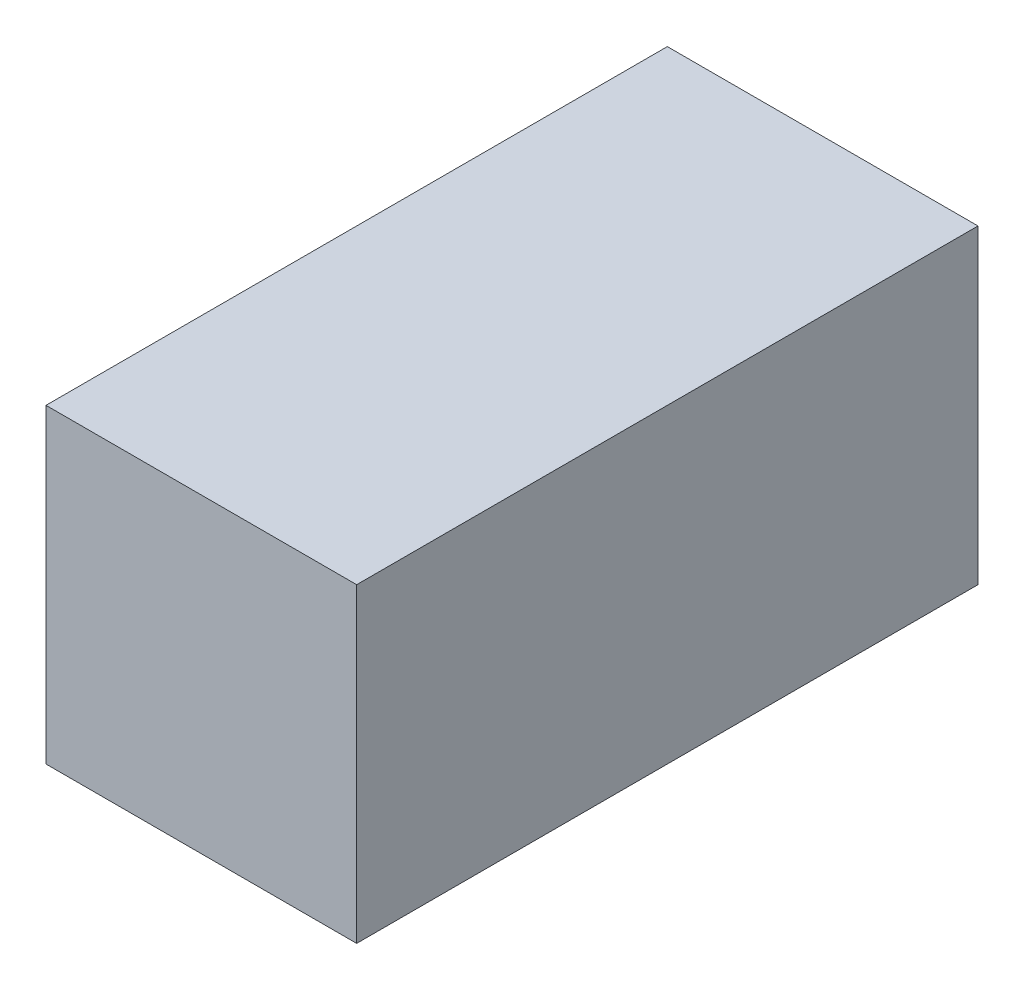
ISO-10303-21;
HEADER;
FILE_DESCRIPTION(('STEP AP214'),'2;1');
FILE_NAME('part.step','',(''),(''),'','','');
FILE_SCHEMA(('AUTOMOTIVE_DESIGN { 1 0 10303 214 1 1 1 1 }'));
ENDSEC;
DATA;
#1=APPLICATION_CONTEXT('core data for automotive mechanical design processes');
#2=APPLICATION_PROTOCOL_DEFINITION('international standard','automotive_design',2000,#1);
#3=PRODUCT_CONTEXT('',#1,'mechanical');
#4=PRODUCT('Part','Part','',(#3));
#5=PRODUCT_RELATED_PRODUCT_CATEGORY('part','',(#4));
#6=PRODUCT_DEFINITION_FORMATION('','',#4);
#7=PRODUCT_DEFINITION_CONTEXT('part definition',#1,'design');
#8=PRODUCT_DEFINITION('design','',#6,#7);
#9=PRODUCT_DEFINITION_SHAPE('','',#8);
#10=(LENGTH_UNIT() NAMED_UNIT(*) SI_UNIT(.MILLI.,.METRE.));
#11=(NAMED_UNIT(*) PLANE_ANGLE_UNIT() SI_UNIT($,.RADIAN.));
#12=(NAMED_UNIT(*) SI_UNIT($,.STERADIAN.) SOLID_ANGLE_UNIT());
#13=UNCERTAINTY_MEASURE_WITH_UNIT(LENGTH_MEASURE(1.E-05),#10,'distance_accuracy_value','');
#14=(GEOMETRIC_REPRESENTATION_CONTEXT(3) GLOBAL_UNCERTAINTY_ASSIGNED_CONTEXT((#13)) GLOBAL_UNIT_ASSIGNED_CONTEXT((#10,
#11,#12)) REPRESENTATION_CONTEXT('',''));
#15=CARTESIAN_POINT('',(0.,0.,0.));
#16=DIRECTION('',(0.,0.,1.));
#17=DIRECTION('',(1.,0.,0.));
#18=AXIS2_PLACEMENT_3D('',#15,#16,#17);
#19=CARTESIAN_POINT('',(0.,0.,10.));
#20=DIRECTION('',(1.,0.,0.));
#21=DIRECTION('',(0.,0.,-1.));
#22=AXIS2_PLACEMENT_3D('',#19,#20,#21);
#23=PLANE('',#22);
#24=DIRECTION('',(0.,-1.,0.));
#25=VECTOR('',#24,1.);
#26=CARTESIAN_POINT('',(0.,0.,0.));
#27=LINE('',#26,#25);
#28=CARTESIAN_POINT('',(0.,5.,0.));
#29=VERTEX_POINT('',#28);
#30=CARTESIAN_POINT('',(0.,0.,0.));
#31=VERTEX_POINT('',#30);
#32=EDGE_CURVE('E95',#29,#31,#27,.T.);
#33=ORIENTED_EDGE('',*,*,#32,.T.);
#34=DIRECTION('',(0.,0.,-1.));
#35=VECTOR('',#34,1.);
#36=CARTESIAN_POINT('',(0.,0.,10.));
#37=LINE('',#36,#35);
#38=CARTESIAN_POINT('',(0.,0.,10.));
#39=VERTEX_POINT('',#38);
#40=EDGE_CURVE('E11',#39,#31,#37,.T.);
#41=ORIENTED_EDGE('',*,*,#40,.F.);
#42=DIRECTION('',(0.,-1.,0.));
#43=VECTOR('',#42,1.);
#44=CARTESIAN_POINT('',(0.,0.,10.));
#45=LINE('',#44,#43);
#46=CARTESIAN_POINT('',(0.,5.,10.));
#47=VERTEX_POINT('',#46);
#48=EDGE_CURVE('E83',#47,#39,#45,.T.);
#49=ORIENTED_EDGE('',*,*,#48,.F.);
#50=DIRECTION('',(0.,0.,-1.));
#51=VECTOR('',#50,1.);
#52=CARTESIAN_POINT('',(0.,5.,10.));
#53=LINE('',#52,#51);
#54=EDGE_CURVE('E91',#47,#29,#53,.T.);
#55=ORIENTED_EDGE('',*,*,#54,.T.);
#56=EDGE_LOOP('',(#33,#41,#49,#55));
#57=FACE_BOUND('',#56,.T.);
#58=ADVANCED_FACE('F32',(#57),#23,.F.);
#59=CARTESIAN_POINT('',(0.,0.,10.));
#60=DIRECTION('',(0.,1.,0.));
#61=DIRECTION('',(0.,0.,1.));
#62=AXIS2_PLACEMENT_3D('',#59,#60,#61);
#63=PLANE('',#62);
#64=DIRECTION('',(1.,0.,0.));
#65=VECTOR('',#64,1.);
#66=CARTESIAN_POINT('',(0.,0.,0.));
#67=LINE('',#66,#65);
#68=CARTESIAN_POINT('',(5.,0.,0.));
#69=VERTEX_POINT('',#68);
#70=EDGE_CURVE('E87',#31,#69,#67,.T.);
#71=ORIENTED_EDGE('',*,*,#70,.T.);
#72=DIRECTION('',(0.,0.,-1.));
#73=VECTOR('',#72,1.);
#74=CARTESIAN_POINT('',(5.,0.,10.));
#75=LINE('',#74,#73);
#76=CARTESIAN_POINT('',(5.,0.,10.));
#77=VERTEX_POINT('',#76);
#78=EDGE_CURVE('E40',#77,#69,#75,.T.);
#79=ORIENTED_EDGE('',*,*,#78,.F.);
#80=DIRECTION('',(1.,0.,0.));
#81=VECTOR('',#80,1.);
#82=CARTESIAN_POINT('',(0.,0.,10.));
#83=LINE('',#82,#81);
#84=EDGE_CURVE('E78',#39,#77,#83,.T.);
#85=ORIENTED_EDGE('',*,*,#84,.F.);
#86=ORIENTED_EDGE('',*,*,#40,.T.);
#87=EDGE_LOOP('',(#71,#79,#85,#86));
#88=FACE_BOUND('',#87,.T.);
#89=ADVANCED_FACE('F86',(#88),#63,.F.);
#90=CARTESIAN_POINT('',(5.,0.,10.));
#91=DIRECTION('',(-1.,0.,0.));
#92=DIRECTION('',(0.,-1.,0.));
#93=AXIS2_PLACEMENT_3D('',#90,#91,#92);
#94=PLANE('',#93);
#95=DIRECTION('',(0.,1.,0.));
#96=VECTOR('',#95,1.);
#97=CARTESIAN_POINT('',(5.,0.,0.));
#98=LINE('',#97,#96);
#99=CARTESIAN_POINT('',(5.,5.,0.));
#100=VERTEX_POINT('',#99);
#101=EDGE_CURVE('E65',#69,#100,#98,.T.);
#102=ORIENTED_EDGE('',*,*,#101,.T.);
#103=DIRECTION('',(0.,0.,-1.));
#104=VECTOR('',#103,1.);
#105=CARTESIAN_POINT('',(5.,5.,10.));
#106=LINE('',#105,#104);
#107=CARTESIAN_POINT('',(5.,5.,10.));
#108=VERTEX_POINT('',#107);
#109=EDGE_CURVE('E88',#108,#100,#106,.T.);
#110=ORIENTED_EDGE('',*,*,#109,.F.);
#111=DIRECTION('',(0.,1.,0.));
#112=VECTOR('',#111,1.);
#113=CARTESIAN_POINT('',(5.,0.,10.));
#114=LINE('',#113,#112);
#115=EDGE_CURVE('E81',#77,#108,#114,.T.);
#116=ORIENTED_EDGE('',*,*,#115,.F.);
#117=ORIENTED_EDGE('',*,*,#78,.T.);
#118=EDGE_LOOP('',(#102,#110,#116,#117));
#119=FACE_BOUND('',#118,.T.);
#120=ADVANCED_FACE('F89',(#119),#94,.F.);
#121=CARTESIAN_POINT('',(0.,5.,10.));
#122=DIRECTION('',(0.,-1.,0.));
#123=DIRECTION('',(0.,0.,-1.));
#124=AXIS2_PLACEMENT_3D('',#121,#122,#123);
#125=PLANE('',#124);
#126=DIRECTION('',(-1.,0.,0.));
#127=VECTOR('',#126,1.);
#128=CARTESIAN_POINT('',(0.,5.,0.));
#129=LINE('',#128,#127);
#130=EDGE_CURVE('E71',#100,#29,#129,.T.);
#131=ORIENTED_EDGE('',*,*,#130,.T.);
#132=ORIENTED_EDGE('',*,*,#54,.F.);
#133=DIRECTION('',(-1.,0.,0.));
#134=VECTOR('',#133,1.);
#135=CARTESIAN_POINT('',(0.,5.,10.));
#136=LINE('',#135,#134);
#137=EDGE_CURVE('E48',#108,#47,#136,.T.);
#138=ORIENTED_EDGE('',*,*,#137,.F.);
#139=ORIENTED_EDGE('',*,*,#109,.T.);
#140=EDGE_LOOP('',(#131,#132,#138,#139));
#141=FACE_BOUND('',#140,.T.);
#142=ADVANCED_FACE('F102',(#141),#125,.F.);
#143=CARTESIAN_POINT('',(0.,5.,10.));
#144=DIRECTION('',(0.,0.,-1.));
#145=DIRECTION('',(-1.,0.,0.));
#146=AXIS2_PLACEMENT_3D('',#143,#144,#145);
#147=PLANE('',#146);
#148=ORIENTED_EDGE('',*,*,#48,.T.);
#149=ORIENTED_EDGE('',*,*,#84,.T.);
#150=ORIENTED_EDGE('',*,*,#115,.T.);
#151=ORIENTED_EDGE('',*,*,#137,.T.);
#152=EDGE_LOOP('',(#148,#149,#150,#151));
#153=FACE_BOUND('',#152,.T.);
#154=ADVANCED_FACE('F79',(#153),#147,.F.);
#155=CARTESIAN_POINT('',(0.,5.,0.));
#156=DIRECTION('',(0.,0.,-1.));
#157=DIRECTION('',(-1.,0.,0.));
#158=AXIS2_PLACEMENT_3D('',#155,#156,#157);
#159=PLANE('',#158);
#160=ORIENTED_EDGE('',*,*,#32,.F.);
#161=ORIENTED_EDGE('',*,*,#130,.F.);
#162=ORIENTED_EDGE('',*,*,#101,.F.);
#163=ORIENTED_EDGE('',*,*,#70,.F.);
#164=EDGE_LOOP('',(#160,#161,#162,#163));
#165=FACE_BOUND('',#164,.T.);
#166=ADVANCED_FACE('F105',(#165),#159,.T.);
#167=CLOSED_SHELL('',(#58,#89,#120,#142,#154,#166));
#168=MANIFOLD_SOLID_BREP('B2',#167);
#169=ADVANCED_BREP_SHAPE_REPRESENTATION('',(#18,#168),#14);
#170=SHAPE_DEFINITION_REPRESENTATION(#9,#169);
ENDSEC;
END-ISO-10303-21;
